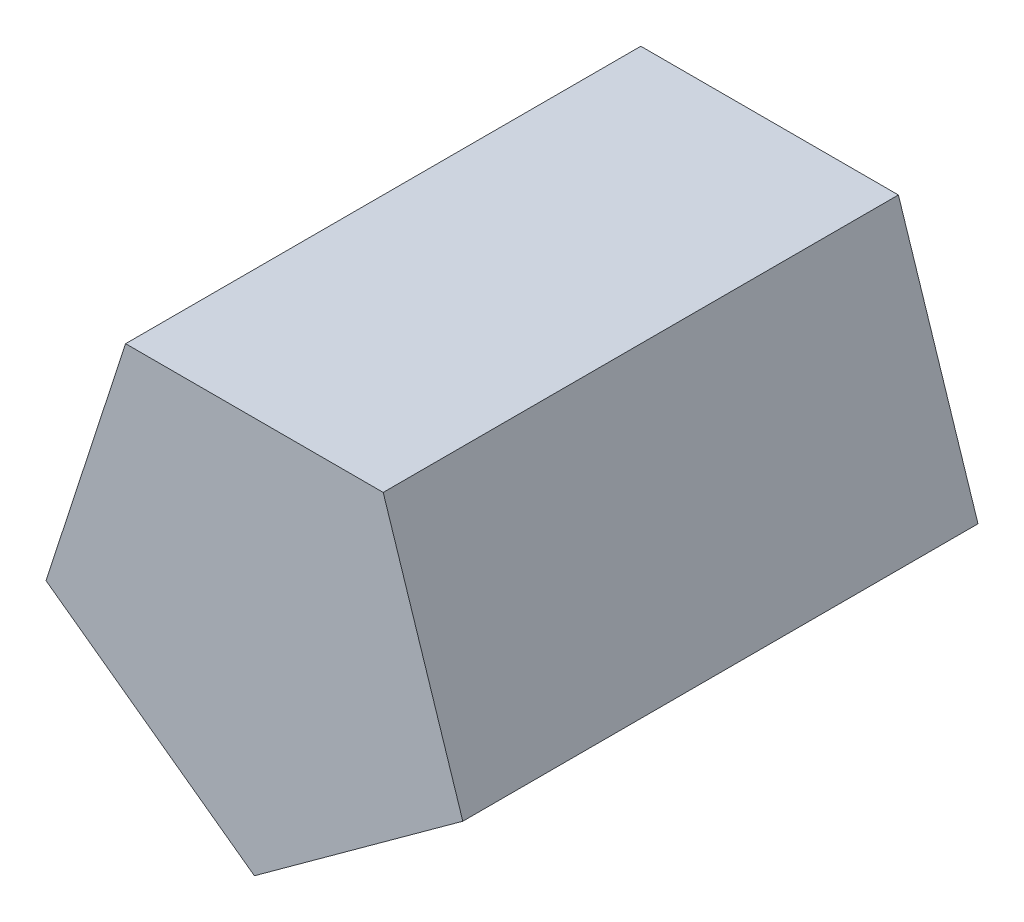
ISO-10303-21;
HEADER;
FILE_DESCRIPTION(('STEP AP214'),'2;1');
FILE_NAME('part.step','',(''),(''),'','','');
FILE_SCHEMA(('AUTOMOTIVE_DESIGN { 1 0 10303 214 1 1 1 1 }'));
ENDSEC;
DATA;
#1=APPLICATION_CONTEXT('core data for automotive mechanical design processes');
#2=APPLICATION_PROTOCOL_DEFINITION('international standard','automotive_design',2000,#1);
#3=PRODUCT_CONTEXT('',#1,'mechanical');
#4=PRODUCT('Part','Part','',(#3));
#5=PRODUCT_RELATED_PRODUCT_CATEGORY('part','',(#4));
#6=PRODUCT_DEFINITION_FORMATION('','',#4);
#7=PRODUCT_DEFINITION_CONTEXT('part definition',#1,'design');
#8=PRODUCT_DEFINITION('design','',#6,#7);
#9=PRODUCT_DEFINITION_SHAPE('','',#8);
#10=(LENGTH_UNIT() NAMED_UNIT(*) SI_UNIT(.MILLI.,.METRE.));
#11=(NAMED_UNIT(*) PLANE_ANGLE_UNIT() SI_UNIT($,.RADIAN.));
#12=(NAMED_UNIT(*) SI_UNIT($,.STERADIAN.) SOLID_ANGLE_UNIT());
#13=UNCERTAINTY_MEASURE_WITH_UNIT(LENGTH_MEASURE(1.E-05),#10,'distance_accuracy_value','');
#14=(GEOMETRIC_REPRESENTATION_CONTEXT(3) GLOBAL_UNCERTAINTY_ASSIGNED_CONTEXT((#13)) GLOBAL_UNIT_ASSIGNED_CONTEXT((#10,
#11,#12)) REPRESENTATION_CONTEXT('',''));
#15=CARTESIAN_POINT('',(0.,0.,0.));
#16=DIRECTION('',(0.,0.,1.));
#17=DIRECTION('',(1.,0.,0.));
#18=AXIS2_PLACEMENT_3D('',#15,#16,#17);
#19=CARTESIAN_POINT('',(27.3579989673613,-10.9063885976098,100.));
#20=DIRECTION('',(-0.951056516295154,-0.309016994374948,0.));
#21=DIRECTION('',(0.309016994374948,-0.951056516295154,0.));
#22=AXIS2_PLACEMENT_3D('',#19,#20,#21);
#23=PLANE('',#22);
#24=DIRECTION('',(-0.309016994374948,0.951056516295154,0.));
#25=VECTOR('',#24,1.);
#26=CARTESIAN_POINT('',(27.3579989673613,-10.9063885976098,0.));
#27=LINE('',#26,#25);
#28=CARTESIAN_POINT('',(27.3579989673613,-10.9063885976098,0.));
#29=VERTEX_POINT('',#28);
#30=CARTESIAN_POINT('',(11.907149248614,36.6464372171478,0.));
#31=VERTEX_POINT('',#30);
#32=EDGE_CURVE('E83',#29,#31,#27,.T.);
#33=ORIENTED_EDGE('',*,*,#32,.T.);
#34=DIRECTION('',(0.,0.,-1.));
#35=VECTOR('',#34,1.);
#36=CARTESIAN_POINT('',(11.907149248614,36.6464372171478,100.));
#37=LINE('',#36,#35);
#38=CARTESIAN_POINT('',(11.907149248614,36.6464372171478,100.));
#39=VERTEX_POINT('',#38);
#40=EDGE_CURVE('E11',#39,#31,#37,.T.);
#41=ORIENTED_EDGE('',*,*,#40,.F.);
#42=DIRECTION('',(-0.309016994374948,0.951056516295154,0.));
#43=VECTOR('',#42,1.);
#44=CARTESIAN_POINT('',(27.3579989673613,-10.9063885976098,100.));
#45=LINE('',#44,#43);
#46=CARTESIAN_POINT('',(27.3579989673613,-10.9063885976098,100.));
#47=VERTEX_POINT('',#46);
#48=EDGE_CURVE('E104',#47,#39,#45,.T.);
#49=ORIENTED_EDGE('',*,*,#48,.F.);
#50=DIRECTION('',(0.,0.,-1.));
#51=VECTOR('',#50,1.);
#52=CARTESIAN_POINT('',(27.3579989673613,-10.9063885976098,100.));
#53=LINE('',#52,#51);
#54=EDGE_CURVE('E96',#47,#29,#53,.T.);
#55=ORIENTED_EDGE('',*,*,#54,.T.);
#56=EDGE_LOOP('',(#33,#41,#49,#55));
#57=FACE_BOUND('',#56,.T.);
#58=ADVANCED_FACE('F33',(#57),#23,.F.);
#59=CARTESIAN_POINT('',(11.907149248614,36.6464372171478,100.));
#60=DIRECTION('',(0.,-1.,0.));
#61=DIRECTION('',(1.,0.,0.));
#62=AXIS2_PLACEMENT_3D('',#59,#60,#61);
#63=PLANE('',#62);
#64=DIRECTION('',(-1.,0.,0.));
#65=VECTOR('',#64,1.);
#66=CARTESIAN_POINT('',(11.907149248614,36.6464372171478,0.));
#67=LINE('',#66,#65);
#68=CARTESIAN_POINT('',(-38.092850751386,36.6464372171478,0.));
#69=VERTEX_POINT('',#68);
#70=EDGE_CURVE('E79',#31,#69,#67,.T.);
#71=ORIENTED_EDGE('',*,*,#70,.T.);
#72=DIRECTION('',(0.,0.,-1.));
#73=VECTOR('',#72,1.);
#74=CARTESIAN_POINT('',(-38.092850751386,36.6464372171478,100.));
#75=LINE('',#74,#73);
#76=CARTESIAN_POINT('',(-38.092850751386,36.6464372171478,100.));
#77=VERTEX_POINT('',#76);
#78=EDGE_CURVE('E40',#77,#69,#75,.T.);
#79=ORIENTED_EDGE('',*,*,#78,.F.);
#80=DIRECTION('',(-1.,0.,0.));
#81=VECTOR('',#80,1.);
#82=CARTESIAN_POINT('',(11.907149248614,36.6464372171478,100.));
#83=LINE('',#82,#81);
#84=EDGE_CURVE('E92',#39,#77,#83,.T.);
#85=ORIENTED_EDGE('',*,*,#84,.F.);
#86=ORIENTED_EDGE('',*,*,#40,.T.);
#87=EDGE_LOOP('',(#71,#79,#85,#86));
#88=FACE_BOUND('',#87,.T.);
#89=ADVANCED_FACE('F91',(#88),#63,.F.);
#90=CARTESIAN_POINT('',(-38.092850751386,36.6464372171478,100.));
#91=DIRECTION('',(0.951056516295154,-0.309016994374947,0.));
#92=DIRECTION('',(0.309016994374947,0.951056516295154,0.));
#93=AXIS2_PLACEMENT_3D('',#90,#91,#92);
#94=PLANE('',#93);
#95=DIRECTION('',(-0.309016994374947,-0.951056516295154,0.));
#96=VECTOR('',#95,1.);
#97=CARTESIAN_POINT('',(-38.092850751386,36.6464372171478,0.));
#98=LINE('',#97,#96);
#99=CARTESIAN_POINT('',(-53.5437004701334,-10.9063885976098,0.));
#100=VERTEX_POINT('',#99);
#101=EDGE_CURVE('E85',#69,#100,#98,.T.);
#102=ORIENTED_EDGE('',*,*,#101,.T.);
#103=DIRECTION('',(0.,0.,-1.));
#104=VECTOR('',#103,1.);
#105=CARTESIAN_POINT('',(-53.5437004701334,-10.9063885976098,100.));
#106=LINE('',#105,#104);
#107=CARTESIAN_POINT('',(-53.5437004701334,-10.9063885976098,100.));
#108=VERTEX_POINT('',#107);
#109=EDGE_CURVE('E115',#108,#100,#106,.T.);
#110=ORIENTED_EDGE('',*,*,#109,.F.);
#111=DIRECTION('',(-0.309016994374947,-0.951056516295154,0.));
#112=VECTOR('',#111,1.);
#113=CARTESIAN_POINT('',(-38.092850751386,36.6464372171478,100.));
#114=LINE('',#113,#112);
#115=EDGE_CURVE('E107',#77,#108,#114,.T.);
#116=ORIENTED_EDGE('',*,*,#115,.F.);
#117=ORIENTED_EDGE('',*,*,#78,.T.);
#118=EDGE_LOOP('',(#102,#110,#116,#117));
#119=FACE_BOUND('',#118,.T.);
#120=ADVANCED_FACE('F119',(#119),#94,.F.);
#121=CARTESIAN_POINT('',(-53.5437004701334,-10.9063885976098,100.));
#122=DIRECTION('',(0.587785252292473,0.809016994374948,0.));
#123=DIRECTION('',(-0.809016994374948,0.587785252292473,0.));
#124=AXIS2_PLACEMENT_3D('',#121,#122,#123);
#125=PLANE('',#124);
#126=DIRECTION('',(0.809016994374948,-0.587785252292473,0.));
#127=VECTOR('',#126,1.);
#128=CARTESIAN_POINT('',(-53.5437004701334,-10.9063885976098,0.));
#129=LINE('',#128,#127);
#130=CARTESIAN_POINT('',(-13.092850751386,-40.2956512122335,0.));
#131=VERTEX_POINT('',#130);
#132=EDGE_CURVE('E100',#100,#131,#129,.T.);
#133=ORIENTED_EDGE('',*,*,#132,.T.);
#134=DIRECTION('',(0.,0.,-1.));
#135=VECTOR('',#134,1.);
#136=CARTESIAN_POINT('',(-13.092850751386,-40.2956512122335,100.));
#137=LINE('',#136,#135);
#138=CARTESIAN_POINT('',(-13.092850751386,-40.2956512122335,100.));
#139=VERTEX_POINT('',#138);
#140=EDGE_CURVE('E112',#139,#131,#137,.T.);
#141=ORIENTED_EDGE('',*,*,#140,.F.);
#142=DIRECTION('',(0.809016994374948,-0.587785252292473,0.));
#143=VECTOR('',#142,1.);
#144=CARTESIAN_POINT('',(-53.5437004701334,-10.9063885976098,100.));
#145=LINE('',#144,#143);
#146=EDGE_CURVE('E52',#108,#139,#145,.T.);
#147=ORIENTED_EDGE('',*,*,#146,.F.);
#148=ORIENTED_EDGE('',*,*,#109,.T.);
#149=EDGE_LOOP('',(#133,#141,#147,#148));
#150=FACE_BOUND('',#149,.T.);
#151=ADVANCED_FACE('F130',(#150),#125,.F.);
#152=CARTESIAN_POINT('',(-13.092850751386,-40.2956512122335,100.));
#153=DIRECTION('',(-0.587785252292473,0.809016994374947,0.));
#154=DIRECTION('',(-0.809016994374947,-0.587785252292473,0.));
#155=AXIS2_PLACEMENT_3D('',#152,#153,#154);
#156=PLANE('',#155);
#157=DIRECTION('',(0.809016994374947,0.587785252292473,0.));
#158=VECTOR('',#157,1.);
#159=CARTESIAN_POINT('',(-13.092850751386,-40.2956512122335,0.));
#160=LINE('',#159,#158);
#161=EDGE_CURVE('E102',#131,#29,#160,.T.);
#162=ORIENTED_EDGE('',*,*,#161,.T.);
#163=ORIENTED_EDGE('',*,*,#54,.F.);
#164=DIRECTION('',(0.809016994374947,0.587785252292473,0.));
#165=VECTOR('',#164,1.);
#166=CARTESIAN_POINT('',(-13.092850751386,-40.2956512122335,100.));
#167=LINE('',#166,#165);
#168=EDGE_CURVE('E47',#139,#47,#167,.T.);
#169=ORIENTED_EDGE('',*,*,#168,.F.);
#170=ORIENTED_EDGE('',*,*,#140,.T.);
#171=EDGE_LOOP('',(#162,#163,#169,#170));
#172=FACE_BOUND('',#171,.T.);
#173=ADVANCED_FACE('F123',(#172),#156,.F.);
#174=CARTESIAN_POINT('',(11.907149248614,36.6464372171478,100.));
#175=DIRECTION('',(0.,0.,1.));
#176=DIRECTION('',(1.,0.,0.));
#177=AXIS2_PLACEMENT_3D('',#174,#175,#176);
#178=PLANE('',#177);
#179=ORIENTED_EDGE('',*,*,#48,.T.);
#180=ORIENTED_EDGE('',*,*,#84,.T.);
#181=ORIENTED_EDGE('',*,*,#115,.T.);
#182=ORIENTED_EDGE('',*,*,#146,.T.);
#183=ORIENTED_EDGE('',*,*,#168,.T.);
#184=EDGE_LOOP('',(#179,#180,#181,#182,#183));
#185=FACE_BOUND('',#184,.T.);
#186=ADVANCED_FACE('F121',(#185),#178,.T.);
#187=CARTESIAN_POINT('',(11.907149248614,36.6464372171478,0.));
#188=DIRECTION('',(0.,0.,1.));
#189=DIRECTION('',(1.,0.,0.));
#190=AXIS2_PLACEMENT_3D('',#187,#188,#189);
#191=PLANE('',#190);
#192=ORIENTED_EDGE('',*,*,#32,.F.);
#193=ORIENTED_EDGE('',*,*,#161,.F.);
#194=ORIENTED_EDGE('',*,*,#132,.F.);
#195=ORIENTED_EDGE('',*,*,#101,.F.);
#196=ORIENTED_EDGE('',*,*,#70,.F.);
#197=EDGE_LOOP('',(#192,#193,#194,#195,#196));
#198=FACE_BOUND('',#197,.T.);
#199=ADVANCED_FACE('F80',(#198),#191,.F.);
#200=CLOSED_SHELL('',(#58,#89,#120,#151,#173,#186,#199));
#201=MANIFOLD_SOLID_BREP('B2',#200);
#202=ADVANCED_BREP_SHAPE_REPRESENTATION('',(#18,#201),#14);
#203=SHAPE_DEFINITION_REPRESENTATION(#9,#202);
ENDSEC;
END-ISO-10303-21;
